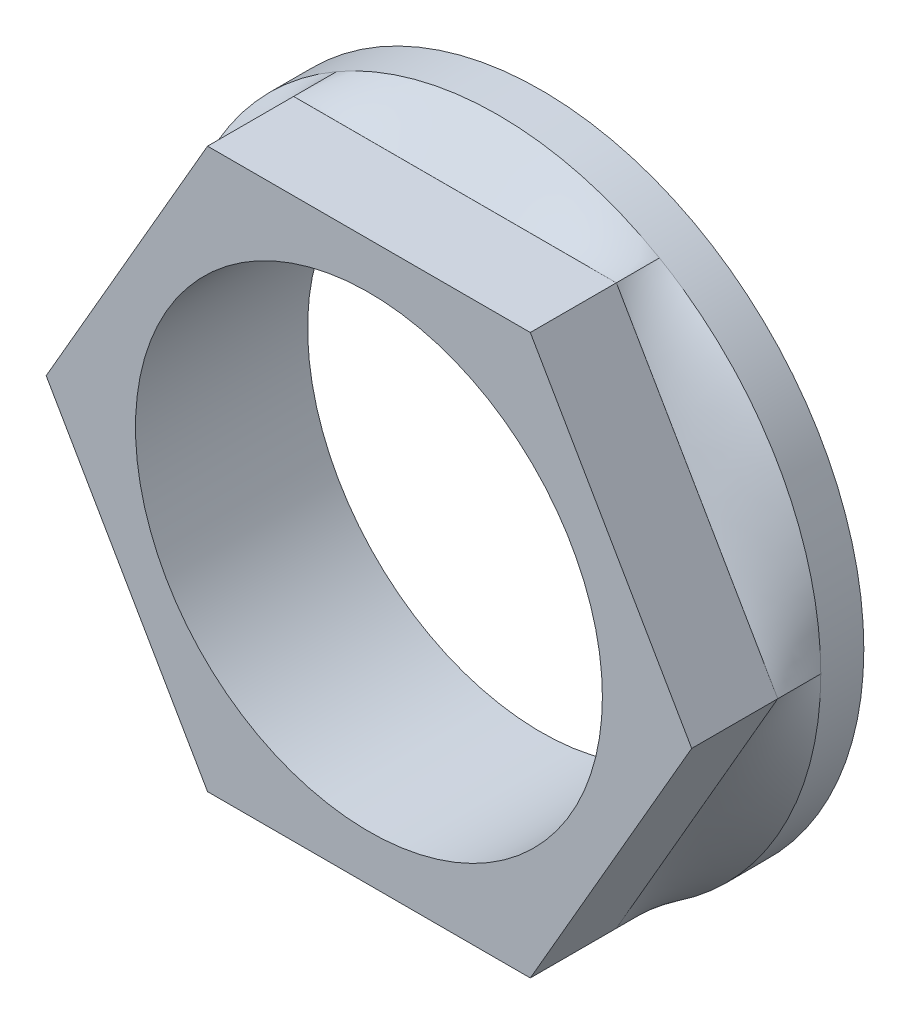
ISO-10303-21;
HEADER;
FILE_DESCRIPTION(('STEP AP214'),'2;1');
FILE_NAME('part.step','',(''),(''),'','','');
FILE_SCHEMA(('AUTOMOTIVE_DESIGN { 1 0 10303 214 1 1 1 1 }'));
ENDSEC;
DATA;
#1=APPLICATION_CONTEXT('core data for automotive mechanical design processes');
#2=APPLICATION_PROTOCOL_DEFINITION('international standard','automotive_design',2000,#1);
#3=PRODUCT_CONTEXT('',#1,'mechanical');
#4=PRODUCT('Part','Part','',(#3));
#5=PRODUCT_RELATED_PRODUCT_CATEGORY('part','',(#4));
#6=PRODUCT_DEFINITION_FORMATION('','',#4);
#7=PRODUCT_DEFINITION_CONTEXT('part definition',#1,'design');
#8=PRODUCT_DEFINITION('design','',#6,#7);
#9=PRODUCT_DEFINITION_SHAPE('','',#8);
#10=(LENGTH_UNIT() NAMED_UNIT(*) SI_UNIT(.MILLI.,.METRE.));
#11=(NAMED_UNIT(*) PLANE_ANGLE_UNIT() SI_UNIT($,.RADIAN.));
#12=(NAMED_UNIT(*) SI_UNIT($,.STERADIAN.) SOLID_ANGLE_UNIT());
#13=UNCERTAINTY_MEASURE_WITH_UNIT(LENGTH_MEASURE(1.E-05),#10,'distance_accuracy_value','');
#14=(GEOMETRIC_REPRESENTATION_CONTEXT(3) GLOBAL_UNCERTAINTY_ASSIGNED_CONTEXT((#13)) GLOBAL_UNIT_ASSIGNED_CONTEXT((#10,
#11,#12)) REPRESENTATION_CONTEXT('',''));
#15=CARTESIAN_POINT('',(0.,0.,0.));
#16=DIRECTION('',(0.,0.,1.));
#17=DIRECTION('',(1.,0.,0.));
#18=AXIS2_PLACEMENT_3D('',#15,#16,#17);
#19=CARTESIAN_POINT('',(0.,0.,2.));
#20=DIRECTION('',(0.,0.,-1.));
#21=DIRECTION('',(-1.,0.,0.));
#22=AXIS2_PLACEMENT_3D('',#19,#20,#21);
#23=CYLINDRICAL_SURFACE('',#22,15.);
#24=CARTESIAN_POINT('',(15.,0.,2.));
#25=CARTESIAN_POINT('',(15.,1.25,2.));
#26=CARTESIAN_POINT('',(14.8412863707631,2.54330446902959,2.));
#27=CARTESIAN_POINT('',(14.1716216612999,5.0889407788024,2.));
#28=CARTESIAN_POINT('',(13.6602540378444,6.33974596215562,2.));
#29=CARTESIAN_POINT('',(12.3205080756888,8.6602540378444,2.));
#30=CARTESIAN_POINT('',(11.4929628234474,9.72851398210639,2.));
#31=CARTESIAN_POINT('',(9.62320946511963,11.5812787874058,2.));
#32=CARTESIAN_POINT('',(8.58253175473053,12.3653810567666,2.));
#33=CARTESIAN_POINT('',(7.49999999999998,12.9903810567666,2.));
#34=B_SPLINE_CURVE_WITH_KNOTS('',3,(#24,#25,#26,#27,#28,#29,#30,#31,#32,#33),.UNSPECIFIED.,.F.,
.F.,(4,2,2,2,4),(0.,0.25,0.5,0.75,1.),.UNSPECIFIED.);
#35=CARTESIAN_POINT('',(15.,0.,2.));
#36=VERTEX_POINT('',#35);
#37=CARTESIAN_POINT('',(7.50003652317277,12.99044427919,2.));
#38=VERTEX_POINT('',#37);
#39=EDGE_CURVE('E12',#36,#38,#34,.T.);
#40=ORIENTED_EDGE('',*,*,#39,.F.);
#41=CARTESIAN_POINT('',(0.,0.,2.));
#42=DIRECTION('',(0.,0.,-1.));
#43=DIRECTION('',(1.,0.,0.));
#44=AXIS2_PLACEMENT_3D('',#41,#42,#43);
#45=CIRCLE('',#44,15.);
#46=CARTESIAN_POINT('',(7.50003248994563,-12.9904372912006,2.));
#47=VERTEX_POINT('',#46);
#48=EDGE_CURVE('E95',#47,#36,#45,.F.);
#49=ORIENTED_EDGE('',*,*,#48,.F.);
#50=CARTESIAN_POINT('',(0.,0.,2.));
#51=DIRECTION('',(0.,0.,1.));
#52=DIRECTION('',(1.,0.,0.));
#53=AXIS2_PLACEMENT_3D('',#50,#51,#52);
#54=CIRCLE('',#53,15.);
#55=CARTESIAN_POINT('',(-7.50003652317222,-12.9904442791891,2.));
#56=VERTEX_POINT('',#55);
#57=EDGE_CURVE('E100',#56,#47,#54,.T.);
#58=ORIENTED_EDGE('',*,*,#57,.F.);
#59=CARTESIAN_POINT('',(0.,0.,2.));
#60=DIRECTION('',(0.,0.,1.));
#61=DIRECTION('',(1.,0.,0.));
#62=AXIS2_PLACEMENT_3D('',#59,#60,#61);
#63=CIRCLE('',#62,15.);
#64=CARTESIAN_POINT('',(-15.,0.,2.));
#65=VERTEX_POINT('',#64);
#66=EDGE_CURVE('E184',#65,#56,#63,.T.);
#67=ORIENTED_EDGE('',*,*,#66,.F.);
#68=CARTESIAN_POINT('',(0.,0.,2.));
#69=DIRECTION('',(0.,0.,1.));
#70=DIRECTION('',(1.,0.,0.));
#71=AXIS2_PLACEMENT_3D('',#68,#69,#70);
#72=CIRCLE('',#71,15.);
#73=CARTESIAN_POINT('',(-7.50003248994581,12.9904372912009,2.));
#74=VERTEX_POINT('',#73);
#75=EDGE_CURVE('E253',#74,#65,#72,.T.);
#76=ORIENTED_EDGE('',*,*,#75,.F.);
#77=CARTESIAN_POINT('',(0.,0.,2.));
#78=DIRECTION('',(0.,0.,1.));
#79=DIRECTION('',(1.,0.,0.));
#80=AXIS2_PLACEMENT_3D('',#77,#78,#79);
#81=CIRCLE('',#80,15.);
#82=EDGE_CURVE('E248',#38,#74,#81,.T.);
#83=ORIENTED_EDGE('',*,*,#82,.F.);
#84=EDGE_LOOP('',(#40,#49,#58,#67,#76,#83));
#85=FACE_BOUND('',#84,.T.);
#86=CARTESIAN_POINT('',(0.,0.,0.));
#87=DIRECTION('',(0.,0.,1.));
#88=DIRECTION('',(1.,0.,0.));
#89=AXIS2_PLACEMENT_3D('',#86,#87,#88);
#90=CIRCLE('',#89,15.);
#91=CARTESIAN_POINT('',(15.,0.,0.));
#92=VERTEX_POINT('',#91);
#93=EDGE_CURVE('E88',#92,#92,#90,.T.);
#94=ORIENTED_EDGE('',*,*,#93,.T.);
#95=EDGE_LOOP('',(#94));
#96=FACE_BOUND('',#95,.T.);
#97=ADVANCED_FACE('F78',(#85,#96),#23,.T.);
#98=CARTESIAN_POINT('',(0.,0.,0.));
#99=DIRECTION('',(0.,0.,1.));
#100=DIRECTION('',(1.,0.,0.));
#101=AXIS2_PLACEMENT_3D('',#98,#99,#100);
#102=PLANE('',#101);
#103=CARTESIAN_POINT('',(0.,0.,0.));
#104=DIRECTION('',(0.,0.,1.));
#105=DIRECTION('',(1.,0.,0.));
#106=AXIS2_PLACEMENT_3D('',#103,#104,#105);
#107=CIRCLE('',#106,10.85);
#108=CARTESIAN_POINT('',(10.85,0.,0.));
#109=VERTEX_POINT('',#108);
#110=EDGE_CURVE('E172',#109,#109,#107,.F.);
#111=ORIENTED_EDGE('',*,*,#110,.F.);
#112=EDGE_LOOP('',(#111));
#113=FACE_BOUND('',#112,.T.);
#114=ORIENTED_EDGE('',*,*,#93,.F.);
#115=EDGE_LOOP('',(#114));
#116=FACE_BOUND('',#115,.T.);
#117=ADVANCED_FACE('F214',(#113,#116),#102,.F.);
#118=CARTESIAN_POINT('',(-7.50000000000003,12.9903810567666,4.));
#119=CARTESIAN_POINT('',(-7.50000000000003,12.9903810567666,2.));
#120=CARTESIAN_POINT('',(-6.25000000000003,12.9903810567666,4.));
#121=CARTESIAN_POINT('',(-6.41746824526948,13.6153810567666,2.));
#122=CARTESIAN_POINT('',(-5.00000000000003,12.9903810567666,4.));
#123=CARTESIAN_POINT('',(-5.21807690564345,14.1245832564354,2.));
#124=CARTESIAN_POINT('',(-2.50000000000003,12.9903810567666,4.));
#125=CARTESIAN_POINT('',(-2.67865883785256,14.8174547609088,2.));
#126=CARTESIAN_POINT('',(-1.25000000000003,12.9903810567666,4.));
#127=CARTESIAN_POINT('',(-1.33974596215565,15.,2.));
#128=CARTESIAN_POINT('',(1.24999999999998,12.9903810567666,4.));
#129=CARTESIAN_POINT('',(1.33974596215558,15.,2.));
#130=CARTESIAN_POINT('',(2.49999999999998,12.9903810567666,4.));
#131=CARTESIAN_POINT('',(2.6786588378525,14.8174547609088,2.));
#132=CARTESIAN_POINT('',(4.99999999999998,12.9903810567666,4.));
#133=CARTESIAN_POINT('',(5.21807690564339,14.1245832564354,2.));
#134=CARTESIAN_POINT('',(6.24999999999998,12.9903810567666,4.));
#135=CARTESIAN_POINT('',(6.41746824526943,13.6153810567666,2.));
#136=CARTESIAN_POINT('',(7.49999999999998,12.9903810567666,4.));
#137=CARTESIAN_POINT('',(7.49999999999998,12.9903810567666,2.));
#138=B_SPLINE_SURFACE_WITH_KNOTS('',3,1,((#118,#119),(#120,#121),(#122,#123),(#124,#125),(#126,
#127),(#128,#129),(#130,#131),(#132,#133),(#134,#135),(#136,#137)),.UNSPECIFIED.,.F.,.F.,.F.,(4,
2,2,2,4),(2,2),(0.,0.25,0.5,0.75,1.),(0.,1.),.UNSPECIFIED.);
#139=DIRECTION('',(-1.,0.,0.));
#140=VECTOR('',#139,1.);
#141=CARTESIAN_POINT('',(7.49999999999998,12.9903810567666,4.));
#142=LINE('',#141,#140);
#143=CARTESIAN_POINT('',(7.49999999999998,12.9903810567666,4.));
#144=VERTEX_POINT('',#143);
#145=CARTESIAN_POINT('',(-7.50000000000003,12.9903810567666,4.));
#146=VERTEX_POINT('',#145);
#147=EDGE_CURVE('E283',#144,#146,#142,.T.);
#148=DIRECTION('',(0.,0.,-1.));
#149=VECTOR('',#148,1.);
#150=CARTESIAN_POINT('',(7.49999999999998,12.9903810567666,3.));
#151=LINE('',#150,#149);
#152=EDGE_CURVE('E251',#144,#38,#151,.T.);
#153=DIRECTION('',(0.,0.,1.));
#154=VECTOR('',#153,1.);
#155=CARTESIAN_POINT('',(-7.50000000000003,12.9903810567666,3.));
#156=LINE('',#155,#154);
#157=EDGE_CURVE('E252',#74,#146,#156,.T.);
#158=ORIENTED_EDGE('',*,*,#147,.F.);
#159=ORIENTED_EDGE('',*,*,#152,.T.);
#160=ORIENTED_EDGE('',*,*,#82,.T.);
#161=ORIENTED_EDGE('',*,*,#157,.T.);
#162=EDGE_LOOP('',(#158,#159,#160,#161));
#163=FACE_BOUND('',#162,.T.);
#164=ADVANCED_FACE('F207',(#163),#138,.T.);
#165=CARTESIAN_POINT('',(7.49999999999998,12.9903810567666,4.));
#166=CARTESIAN_POINT('',(7.49999999999998,12.9903810567666,2.));
#167=CARTESIAN_POINT('',(8.12499999999998,11.907849302036,4.));
#168=CARTESIAN_POINT('',(8.58253175473053,12.3653810567666,2.));
#169=CARTESIAN_POINT('',(8.74999999999998,10.8253175473055,4.));
#170=CARTESIAN_POINT('',(9.62320946511963,11.5812787874058,2.));
#171=CARTESIAN_POINT('',(9.99999999999998,8.6602540378444,4.));
#172=CARTESIAN_POINT('',(11.4929628234474,9.72851398210639,2.));
#173=CARTESIAN_POINT('',(10.625,7.57772228311385,4.));
#174=CARTESIAN_POINT('',(12.3205080756888,8.6602540378444,2.));
#175=CARTESIAN_POINT('',(11.875,5.41265877365276,4.));
#176=CARTESIAN_POINT('',(13.6602540378444,6.33974596215562,2.));
#177=CARTESIAN_POINT('',(12.5,4.33012701892222,4.));
#178=CARTESIAN_POINT('',(14.1716216612999,5.0889407788024,2.));
#179=CARTESIAN_POINT('',(13.75,2.16506350946112,4.));
#180=CARTESIAN_POINT('',(14.8412863707631,2.54330446902959,2.));
#181=CARTESIAN_POINT('',(14.375,1.08253175473058,4.));
#182=CARTESIAN_POINT('',(15.,1.25,2.));
#183=CARTESIAN_POINT('',(15.,0.,4.));
#184=CARTESIAN_POINT('',(15.,0.,2.));
#185=B_SPLINE_SURFACE_WITH_KNOTS('',3,1,((#165,#166),(#167,#168),(#169,#170),(#171,#172),(#173,
#174),(#175,#176),(#177,#178),(#179,#180),(#181,#182),(#183,#184)),.UNSPECIFIED.,.F.,.F.,.F.,(4,
2,2,2,4),(2,2),(0.,0.25,0.5,0.75,1.),(0.,1.),.UNSPECIFIED.);
#186=DIRECTION('',(-0.500000000000001,0.866025403784438,0.));
#187=VECTOR('',#186,1.);
#188=CARTESIAN_POINT('',(15.,0.,4.));
#189=LINE('',#188,#187);
#190=CARTESIAN_POINT('',(15.,0.,4.));
#191=VERTEX_POINT('',#190);
#192=EDGE_CURVE('E179',#191,#144,#189,.T.);
#193=DIRECTION('',(0.,0.,-1.));
#194=VECTOR('',#193,1.);
#195=CARTESIAN_POINT('',(15.,0.,3.));
#196=LINE('',#195,#194);
#197=EDGE_CURVE('E278',#191,#36,#196,.T.);
#198=ORIENTED_EDGE('',*,*,#192,.F.);
#199=ORIENTED_EDGE('',*,*,#197,.T.);
#200=ORIENTED_EDGE('',*,*,#39,.T.);
#201=ORIENTED_EDGE('',*,*,#152,.F.);
#202=EDGE_LOOP('',(#198,#199,#200,#201));
#203=FACE_BOUND('',#202,.T.);
#204=ADVANCED_FACE('F213',(#203),#185,.T.);
#205=CARTESIAN_POINT('',(-15.,0.,4.));
#206=CARTESIAN_POINT('',(-15.,0.,2.));
#207=CARTESIAN_POINT('',(-14.375,1.08253175473052,4.));
#208=CARTESIAN_POINT('',(-15.,1.24999999999997,2.));
#209=CARTESIAN_POINT('',(-13.75,2.16506350946106,4.));
#210=CARTESIAN_POINT('',(-14.8412863707631,2.54330446902956,2.));
#211=CARTESIAN_POINT('',(-12.5,4.33012701892216,4.));
#212=CARTESIAN_POINT('',(-14.1716216612999,5.08894077880237,2.));
#213=CARTESIAN_POINT('',(-11.875,5.4126587736527,4.));
#214=CARTESIAN_POINT('',(-13.6602540378444,6.33974596215559,2.));
#215=CARTESIAN_POINT('',(-10.625,7.5777222831138,4.));
#216=CARTESIAN_POINT('',(-12.3205080756888,8.66025403784436,2.));
#217=CARTESIAN_POINT('',(-10.,8.66025403784435,4.));
#218=CARTESIAN_POINT('',(-11.4929628234474,9.72851398210635,2.));
#219=CARTESIAN_POINT('',(-8.75000000000002,10.8253175473055,4.));
#220=CARTESIAN_POINT('',(-9.62320946511967,11.5812787874058,2.));
#221=CARTESIAN_POINT('',(-8.12500000000003,11.907849302036,4.));
#222=CARTESIAN_POINT('',(-8.58253175473058,12.3653810567666,2.));
#223=CARTESIAN_POINT('',(-7.50000000000003,12.9903810567666,4.));
#224=CARTESIAN_POINT('',(-7.50000000000003,12.9903810567666,2.));
#225=B_SPLINE_SURFACE_WITH_KNOTS('',3,1,((#205,#206),(#207,#208),(#209,#210),(#211,#212),(#213,
#214),(#215,#216),(#217,#218),(#219,#220),(#221,#222),(#223,#224)),.UNSPECIFIED.,.F.,.F.,.F.,(4,
2,2,2,4),(2,2),(0.,0.25,0.5,0.75,1.),(0.,1.),.UNSPECIFIED.);
#226=DIRECTION('',(-0.499999999999998,-0.86602540378444,0.));
#227=VECTOR('',#226,1.);
#228=CARTESIAN_POINT('',(-7.50000000000003,12.9903810567666,4.));
#229=LINE('',#228,#227);
#230=CARTESIAN_POINT('',(-15.,0.,4.));
#231=VERTEX_POINT('',#230);
#232=EDGE_CURVE('E388',#146,#231,#229,.T.);
#233=DIRECTION('',(0.,0.,-1.));
#234=VECTOR('',#233,1.);
#235=CARTESIAN_POINT('',(-15.,0.,3.));
#236=LINE('',#235,#234);
#237=EDGE_CURVE('E376',#231,#65,#236,.T.);
#238=ORIENTED_EDGE('',*,*,#232,.F.);
#239=ORIENTED_EDGE('',*,*,#157,.F.);
#240=ORIENTED_EDGE('',*,*,#75,.T.);
#241=ORIENTED_EDGE('',*,*,#237,.F.);
#242=EDGE_LOOP('',(#238,#239,#240,#241));
#243=FACE_BOUND('',#242,.T.);
#244=ADVANCED_FACE('F319',(#243),#225,.T.);
#245=CARTESIAN_POINT('',(15.,0.,4.));
#246=CARTESIAN_POINT('',(15.,0.,2.));
#247=CARTESIAN_POINT('',(14.375,-1.08253175473052,4.));
#248=CARTESIAN_POINT('',(15.,-1.25,2.));
#249=CARTESIAN_POINT('',(13.75,-2.16506350946106,4.));
#250=CARTESIAN_POINT('',(14.8412863707631,-2.54330446902958,2.));
#251=CARTESIAN_POINT('',(12.5,-4.33012701892216,4.));
#252=CARTESIAN_POINT('',(14.1716216612999,-5.08894077880238,2.));
#253=CARTESIAN_POINT('',(11.875,-5.41265877365271,4.));
#254=CARTESIAN_POINT('',(13.6602540378444,-6.3397459621556,2.));
#255=CARTESIAN_POINT('',(10.625,-7.5777222831138,4.));
#256=CARTESIAN_POINT('',(12.3205080756888,-8.66025403784437,2.));
#257=CARTESIAN_POINT('',(10.,-8.66025403784436,4.));
#258=CARTESIAN_POINT('',(11.4929628234474,-9.72851398210636,2.));
#259=CARTESIAN_POINT('',(8.75000000000002,-10.8253175473055,4.));
#260=CARTESIAN_POINT('',(9.62320946511967,-11.5812787874058,2.));
#261=CARTESIAN_POINT('',(8.12500000000002,-11.907849302036,4.));
#262=CARTESIAN_POINT('',(8.58253175473057,-12.3653810567666,2.));
#263=CARTESIAN_POINT('',(7.50000000000003,-12.9903810567666,4.));
#264=CARTESIAN_POINT('',(7.50000000000002,-12.9903810567666,2.));
#265=B_SPLINE_SURFACE_WITH_KNOTS('',3,1,((#245,#246),(#247,#248),(#249,#250),(#251,#252),(#253,
#254),(#255,#256),(#257,#258),(#259,#260),(#261,#262),(#263,#264)),.UNSPECIFIED.,.F.,.F.,.F.,(4,
2,2,2,4),(2,2),(0.,0.25,0.5,0.75,1.),(0.,1.),.UNSPECIFIED.);
#266=DIRECTION('',(0.499999999999998,0.86602540378444,0.));
#267=VECTOR('',#266,1.);
#268=CARTESIAN_POINT('',(7.50000000000003,-12.9903810567666,4.));
#269=LINE('',#268,#267);
#270=CARTESIAN_POINT('',(7.50000000000003,-12.9903810567666,4.));
#271=VERTEX_POINT('',#270);
#272=EDGE_CURVE('E82',#271,#191,#269,.T.);
#273=DIRECTION('',(0.,0.,-1.));
#274=VECTOR('',#273,1.);
#275=CARTESIAN_POINT('',(7.50000000000002,-12.9903810567666,3.));
#276=LINE('',#275,#274);
#277=EDGE_CURVE('E256',#271,#47,#276,.T.);
#278=ORIENTED_EDGE('',*,*,#272,.F.);
#279=ORIENTED_EDGE('',*,*,#277,.T.);
#280=ORIENTED_EDGE('',*,*,#48,.T.);
#281=ORIENTED_EDGE('',*,*,#197,.F.);
#282=EDGE_LOOP('',(#278,#279,#280,#281));
#283=FACE_BOUND('',#282,.T.);
#284=ADVANCED_FACE('F307',(#283),#265,.T.);
#285=CARTESIAN_POINT('',(7.50000000000003,-12.9903810567666,4.));
#286=CARTESIAN_POINT('',(7.50000000000002,-12.9903810567666,2.));
#287=CARTESIAN_POINT('',(6.25000000000003,-12.9903810567666,4.));
#288=CARTESIAN_POINT('',(6.41746824526948,-13.6153810567666,2.));
#289=CARTESIAN_POINT('',(5.00000000000003,-12.9903810567666,4.));
#290=CARTESIAN_POINT('',(5.21807690564344,-14.1245832564354,2.));
#291=CARTESIAN_POINT('',(2.50000000000003,-12.9903810567666,4.));
#292=CARTESIAN_POINT('',(2.67865883785256,-14.8174547609088,2.));
#293=CARTESIAN_POINT('',(1.25000000000003,-12.9903810567666,4.));
#294=CARTESIAN_POINT('',(1.33974596215564,-15.,2.));
#295=CARTESIAN_POINT('',(-1.24999999999997,-12.9903810567666,4.));
#296=CARTESIAN_POINT('',(-1.33974596215558,-15.,2.));
#297=CARTESIAN_POINT('',(-2.49999999999997,-12.9903810567666,4.));
#298=CARTESIAN_POINT('',(-2.6786588378525,-14.8174547609088,2.));
#299=CARTESIAN_POINT('',(-4.99999999999997,-12.9903810567666,4.));
#300=CARTESIAN_POINT('',(-5.21807690564339,-14.1245832564354,2.));
#301=CARTESIAN_POINT('',(-6.24999999999997,-12.9903810567666,4.));
#302=CARTESIAN_POINT('',(-6.41746824526942,-13.6153810567666,2.));
#303=CARTESIAN_POINT('',(-7.49999999999997,-12.9903810567666,4.));
#304=CARTESIAN_POINT('',(-7.49999999999997,-12.9903810567666,2.));
#305=B_SPLINE_SURFACE_WITH_KNOTS('',3,1,((#285,#286),(#287,#288),(#289,#290),(#291,#292),(#293,
#294),(#295,#296),(#297,#298),(#299,#300),(#301,#302),(#303,#304)),.UNSPECIFIED.,.F.,.F.,.F.,(4,
2,2,2,4),(2,2),(0.,0.25,0.5,0.75,1.),(0.,1.),.UNSPECIFIED.);
#306=DIRECTION('',(1.,0.,0.));
#307=VECTOR('',#306,1.);
#308=CARTESIAN_POINT('',(-7.49999999999997,-12.9903810567666,4.));
#309=LINE('',#308,#307);
#310=CARTESIAN_POINT('',(-7.49999999999997,-12.9903810567666,4.));
#311=VERTEX_POINT('',#310);
#312=EDGE_CURVE('E176',#311,#271,#309,.T.);
#313=DIRECTION('',(0.,0.,-1.));
#314=VECTOR('',#313,1.);
#315=CARTESIAN_POINT('',(-7.49999999999997,-12.9903810567666,3.));
#316=LINE('',#315,#314);
#317=EDGE_CURVE('E359',#311,#56,#316,.T.);
#318=ORIENTED_EDGE('',*,*,#312,.F.);
#319=ORIENTED_EDGE('',*,*,#317,.T.);
#320=ORIENTED_EDGE('',*,*,#57,.T.);
#321=ORIENTED_EDGE('',*,*,#277,.F.);
#322=EDGE_LOOP('',(#318,#319,#320,#321));
#323=FACE_BOUND('',#322,.T.);
#324=ADVANCED_FACE('F318',(#323),#305,.T.);
#325=CARTESIAN_POINT('',(-7.49999999999997,-12.9903810567666,4.));
#326=CARTESIAN_POINT('',(-7.49999999999997,-12.9903810567666,2.));
#327=CARTESIAN_POINT('',(-8.12499999999998,-11.907849302036,4.));
#328=CARTESIAN_POINT('',(-8.58253175473052,-12.3653810567666,2.));
#329=CARTESIAN_POINT('',(-8.74999999999998,-10.8253175473055,4.));
#330=CARTESIAN_POINT('',(-9.62320946511963,-11.5812787874058,2.));
#331=CARTESIAN_POINT('',(-9.99999999999998,-8.66025403784441,4.));
#332=CARTESIAN_POINT('',(-11.4929628234474,-9.7285139821064,2.));
#333=CARTESIAN_POINT('',(-10.625,-7.57772228311386,4.));
#334=CARTESIAN_POINT('',(-12.3205080756888,-8.66025403784441,2.));
#335=CARTESIAN_POINT('',(-11.875,-5.41265877365276,4.));
#336=CARTESIAN_POINT('',(-13.6602540378444,-6.33974596215564,2.));
#337=CARTESIAN_POINT('',(-12.5,-4.33012701892222,4.));
#338=CARTESIAN_POINT('',(-14.1716216612999,-5.08894077880242,2.));
#339=CARTESIAN_POINT('',(-13.75,-2.16506350946112,4.));
#340=CARTESIAN_POINT('',(-14.8412863707631,-2.54330446902961,2.));
#341=CARTESIAN_POINT('',(-14.375,-1.08253175473058,4.));
#342=CARTESIAN_POINT('',(-15.,-1.25000000000003,2.));
#343=CARTESIAN_POINT('',(-15.,0.,4.));
#344=CARTESIAN_POINT('',(-15.,0.,2.));
#345=B_SPLINE_SURFACE_WITH_KNOTS('',3,1,((#325,#326),(#327,#328),(#329,#330),(#331,#332),(#333,
#334),(#335,#336),(#337,#338),(#339,#340),(#341,#342),(#343,#344)),.UNSPECIFIED.,.F.,.F.,.F.,(4,
2,2,2,4),(2,2),(0.,0.25,0.5,0.75,1.),(0.,1.),.UNSPECIFIED.);
#346=DIRECTION('',(0.500000000000002,-0.866025403784438,0.));
#347=VECTOR('',#346,1.);
#348=CARTESIAN_POINT('',(-15.,0.,4.));
#349=LINE('',#348,#347);
#350=EDGE_CURVE('E371',#231,#311,#349,.T.);
#351=ORIENTED_EDGE('',*,*,#350,.F.);
#352=ORIENTED_EDGE('',*,*,#237,.T.);
#353=ORIENTED_EDGE('',*,*,#66,.T.);
#354=ORIENTED_EDGE('',*,*,#317,.F.);
#355=EDGE_LOOP('',(#351,#352,#353,#354));
#356=FACE_BOUND('',#355,.T.);
#357=ADVANCED_FACE('F204',(#356),#345,.T.);
#358=CARTESIAN_POINT('',(-7.49999999999997,-12.9903810567666,8.));
#359=DIRECTION('',(0.,1.,0.));
#360=DIRECTION('',(-1.,0.,0.));
#361=AXIS2_PLACEMENT_3D('',#358,#359,#360);
#362=PLANE('',#361);
#363=ORIENTED_EDGE('',*,*,#312,.T.);
#364=DIRECTION('',(0.,0.,-1.));
#365=VECTOR('',#364,1.);
#366=CARTESIAN_POINT('',(7.50000000000003,-12.9903810567666,8.));
#367=LINE('',#366,#365);
#368=CARTESIAN_POINT('',(7.50000000000003,-12.9903810567666,8.));
#369=VERTEX_POINT('',#368);
#370=EDGE_CURVE('E156',#369,#271,#367,.T.);
#371=ORIENTED_EDGE('',*,*,#370,.F.);
#372=DIRECTION('',(1.,0.,0.));
#373=VECTOR('',#372,1.);
#374=CARTESIAN_POINT('',(-7.49999999999997,-12.9903810567666,8.));
#375=LINE('',#374,#373);
#376=CARTESIAN_POINT('',(-7.49999999999997,-12.9903810567666,8.));
#377=VERTEX_POINT('',#376);
#378=EDGE_CURVE('E163',#377,#369,#375,.T.);
#379=ORIENTED_EDGE('',*,*,#378,.F.);
#380=DIRECTION('',(0.,0.,-1.));
#381=VECTOR('',#380,1.);
#382=CARTESIAN_POINT('',(-7.49999999999997,-12.9903810567666,8.));
#383=LINE('',#382,#381);
#384=EDGE_CURVE('E511',#377,#311,#383,.T.);
#385=ORIENTED_EDGE('',*,*,#384,.T.);
#386=EDGE_LOOP('',(#363,#371,#379,#385));
#387=FACE_BOUND('',#386,.T.);
#388=ADVANCED_FACE('F174',(#387),#362,.F.);
#389=CARTESIAN_POINT('',(7.50000000000003,-12.9903810567666,8.));
#390=DIRECTION('',(-0.86602540378444,0.499999999999998,0.));
#391=DIRECTION('',(-0.499999999999998,-0.86602540378444,0.));
#392=AXIS2_PLACEMENT_3D('',#389,#390,#391);
#393=PLANE('',#392);
#394=ORIENTED_EDGE('',*,*,#272,.T.);
#395=DIRECTION('',(0.,0.,-1.));
#396=VECTOR('',#395,1.);
#397=CARTESIAN_POINT('',(15.,0.,8.));
#398=LINE('',#397,#396);
#399=CARTESIAN_POINT('',(15.,0.,8.));
#400=VERTEX_POINT('',#399);
#401=EDGE_CURVE('E159',#400,#191,#398,.T.);
#402=ORIENTED_EDGE('',*,*,#401,.F.);
#403=DIRECTION('',(0.499999999999998,0.86602540378444,0.));
#404=VECTOR('',#403,1.);
#405=CARTESIAN_POINT('',(7.50000000000003,-12.9903810567666,8.));
#406=LINE('',#405,#404);
#407=EDGE_CURVE('E151',#369,#400,#406,.T.);
#408=ORIENTED_EDGE('',*,*,#407,.F.);
#409=ORIENTED_EDGE('',*,*,#370,.T.);
#410=EDGE_LOOP('',(#394,#402,#408,#409));
#411=FACE_BOUND('',#410,.T.);
#412=ADVANCED_FACE('F154',(#411),#393,.F.);
#413=CARTESIAN_POINT('',(15.,0.,8.));
#414=DIRECTION('',(-0.866025403784438,-0.500000000000001,0.));
#415=DIRECTION('',(0.500000000000001,-0.866025403784438,0.));
#416=AXIS2_PLACEMENT_3D('',#413,#414,#415);
#417=PLANE('',#416);
#418=ORIENTED_EDGE('',*,*,#192,.T.);
#419=DIRECTION('',(0.,0.,-1.));
#420=VECTOR('',#419,1.);
#421=CARTESIAN_POINT('',(7.49999999999998,12.9903810567666,8.));
#422=LINE('',#421,#420);
#423=CARTESIAN_POINT('',(7.49999999999998,12.9903810567666,8.));
#424=VERTEX_POINT('',#423);
#425=EDGE_CURVE('E180',#424,#144,#422,.T.);
#426=ORIENTED_EDGE('',*,*,#425,.F.);
#427=DIRECTION('',(-0.500000000000001,0.866025403784438,0.));
#428=VECTOR('',#427,1.);
#429=CARTESIAN_POINT('',(15.,0.,8.));
#430=LINE('',#429,#428);
#431=EDGE_CURVE('E162',#400,#424,#430,.T.);
#432=ORIENTED_EDGE('',*,*,#431,.F.);
#433=ORIENTED_EDGE('',*,*,#401,.T.);
#434=EDGE_LOOP('',(#418,#426,#432,#433));
#435=FACE_BOUND('',#434,.T.);
#436=ADVANCED_FACE('F449',(#435),#417,.F.);
#437=CARTESIAN_POINT('',(7.49999999999998,12.9903810567666,8.));
#438=DIRECTION('',(0.,-1.,0.));
#439=DIRECTION('',(1.,0.,0.));
#440=AXIS2_PLACEMENT_3D('',#437,#438,#439);
#441=PLANE('',#440);
#442=ORIENTED_EDGE('',*,*,#147,.T.);
#443=DIRECTION('',(0.,0.,-1.));
#444=VECTOR('',#443,1.);
#445=CARTESIAN_POINT('',(-7.50000000000003,12.9903810567666,8.));
#446=LINE('',#445,#444);
#447=CARTESIAN_POINT('',(-7.50000000000003,12.9903810567666,8.));
#448=VERTEX_POINT('',#447);
#449=EDGE_CURVE('E426',#448,#146,#446,.T.);
#450=ORIENTED_EDGE('',*,*,#449,.F.);
#451=DIRECTION('',(-1.,0.,0.));
#452=VECTOR('',#451,1.);
#453=CARTESIAN_POINT('',(7.49999999999998,12.9903810567666,8.));
#454=LINE('',#453,#452);
#455=EDGE_CURVE('E507',#424,#448,#454,.T.);
#456=ORIENTED_EDGE('',*,*,#455,.F.);
#457=ORIENTED_EDGE('',*,*,#425,.T.);
#458=EDGE_LOOP('',(#442,#450,#456,#457));
#459=FACE_BOUND('',#458,.T.);
#460=ADVANCED_FACE('F440',(#459),#441,.F.);
#461=CARTESIAN_POINT('',(-7.50000000000003,12.9903810567666,8.));
#462=DIRECTION('',(0.86602540378444,-0.499999999999998,0.));
#463=DIRECTION('',(0.499999999999998,0.86602540378444,0.));
#464=AXIS2_PLACEMENT_3D('',#461,#462,#463);
#465=PLANE('',#464);
#466=ORIENTED_EDGE('',*,*,#232,.T.);
#467=DIRECTION('',(0.,0.,-1.));
#468=VECTOR('',#467,1.);
#469=CARTESIAN_POINT('',(-15.,0.,8.));
#470=LINE('',#469,#468);
#471=CARTESIAN_POINT('',(-15.,0.,8.));
#472=VERTEX_POINT('',#471);
#473=EDGE_CURVE('E410',#472,#231,#470,.T.);
#474=ORIENTED_EDGE('',*,*,#473,.F.);
#475=DIRECTION('',(-0.499999999999998,-0.86602540378444,0.));
#476=VECTOR('',#475,1.);
#477=CARTESIAN_POINT('',(-7.50000000000003,12.9903810567666,8.));
#478=LINE('',#477,#476);
#479=EDGE_CURVE('E509',#448,#472,#478,.T.);
#480=ORIENTED_EDGE('',*,*,#479,.F.);
#481=ORIENTED_EDGE('',*,*,#449,.T.);
#482=EDGE_LOOP('',(#466,#474,#480,#481));
#483=FACE_BOUND('',#482,.T.);
#484=ADVANCED_FACE('F448',(#483),#465,.F.);
#485=CARTESIAN_POINT('',(-15.,0.,8.));
#486=DIRECTION('',(0.866025403784438,0.500000000000002,0.));
#487=DIRECTION('',(-0.500000000000002,0.866025403784438,0.));
#488=AXIS2_PLACEMENT_3D('',#485,#486,#487);
#489=PLANE('',#488);
#490=ORIENTED_EDGE('',*,*,#350,.T.);
#491=ORIENTED_EDGE('',*,*,#384,.F.);
#492=DIRECTION('',(0.500000000000002,-0.866025403784438,0.));
#493=VECTOR('',#492,1.);
#494=CARTESIAN_POINT('',(-15.,0.,8.));
#495=LINE('',#494,#493);
#496=EDGE_CURVE('E168',#472,#377,#495,.T.);
#497=ORIENTED_EDGE('',*,*,#496,.F.);
#498=ORIENTED_EDGE('',*,*,#473,.T.);
#499=EDGE_LOOP('',(#490,#491,#497,#498));
#500=FACE_BOUND('',#499,.T.);
#501=ADVANCED_FACE('F515',(#500),#489,.F.);
#502=CARTESIAN_POINT('',(0.,0.,8.));
#503=DIRECTION('',(0.,0.,1.));
#504=DIRECTION('',(1.,0.,0.));
#505=AXIS2_PLACEMENT_3D('',#502,#503,#504);
#506=PLANE('',#505);
#507=CARTESIAN_POINT('',(0.,0.,8.));
#508=DIRECTION('',(0.,0.,1.));
#509=DIRECTION('',(1.,0.,0.));
#510=AXIS2_PLACEMENT_3D('',#507,#508,#509);
#511=CIRCLE('',#510,10.85);
#512=CARTESIAN_POINT('',(10.85,0.,8.));
#513=VERTEX_POINT('',#512);
#514=EDGE_CURVE('E501',#513,#513,#511,.T.);
#515=ORIENTED_EDGE('',*,*,#514,.F.);
#516=EDGE_LOOP('',(#515));
#517=FACE_BOUND('',#516,.T.);
#518=ORIENTED_EDGE('',*,*,#378,.T.);
#519=ORIENTED_EDGE('',*,*,#407,.T.);
#520=ORIENTED_EDGE('',*,*,#431,.T.);
#521=ORIENTED_EDGE('',*,*,#455,.T.);
#522=ORIENTED_EDGE('',*,*,#479,.T.);
#523=ORIENTED_EDGE('',*,*,#496,.T.);
#524=EDGE_LOOP('',(#518,#519,#520,#521,#522,#523));
#525=FACE_BOUND('',#524,.T.);
#526=ADVANCED_FACE('F166',(#517,#525),#506,.T.);
#527=CARTESIAN_POINT('',(0.,0.,-0.000999999999999265));
#528=DIRECTION('',(0.,0.,1.));
#529=DIRECTION('',(1.,0.,0.));
#530=AXIS2_PLACEMENT_3D('',#527,#528,#529);
#531=CYLINDRICAL_SURFACE('',#530,10.85);
#532=ORIENTED_EDGE('',*,*,#514,.T.);
#533=EDGE_LOOP('',(#532));
#534=FACE_BOUND('',#533,.T.);
#535=ORIENTED_EDGE('',*,*,#110,.T.);
#536=EDGE_LOOP('',(#535));
#537=FACE_BOUND('',#536,.T.);
#538=ADVANCED_FACE('F529',(#534,#537),#531,.F.);
#539=CLOSED_SHELL('',(#97,#117,#164,#204,#244,#284,#324,#357,#388,#412,#436,#460,#484,#501,#526,#538));
#540=MANIFOLD_SOLID_BREP('B2',#539);
#541=ADVANCED_BREP_SHAPE_REPRESENTATION('',(#18,#540),#14);
#542=SHAPE_DEFINITION_REPRESENTATION(#9,#541);
ENDSEC;
END-ISO-10303-21;
